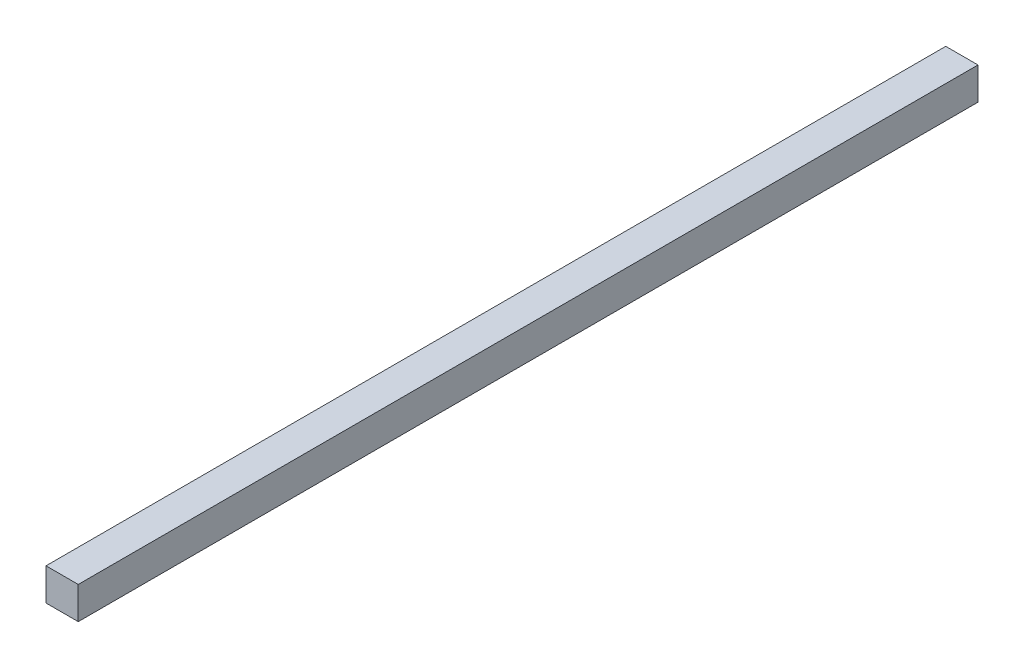
ISO-10303-21;
HEADER;
FILE_DESCRIPTION(('STEP AP214'),'2;1');
FILE_NAME('part.step','',(''),(''),'','','');
FILE_SCHEMA(('AUTOMOTIVE_DESIGN { 1 0 10303 214 1 1 1 1 }'));
ENDSEC;
DATA;
#1=APPLICATION_CONTEXT('core data for automotive mechanical design processes');
#2=APPLICATION_PROTOCOL_DEFINITION('international standard','automotive_design',2000,#1);
#3=PRODUCT_CONTEXT('',#1,'mechanical');
#4=PRODUCT('Part','Part','',(#3));
#5=PRODUCT_RELATED_PRODUCT_CATEGORY('part','',(#4));
#6=PRODUCT_DEFINITION_FORMATION('','',#4);
#7=PRODUCT_DEFINITION_CONTEXT('part definition',#1,'design');
#8=PRODUCT_DEFINITION('design','',#6,#7);
#9=PRODUCT_DEFINITION_SHAPE('','',#8);
#10=(LENGTH_UNIT() NAMED_UNIT(*) SI_UNIT(.MILLI.,.METRE.));
#11=(NAMED_UNIT(*) PLANE_ANGLE_UNIT() SI_UNIT($,.RADIAN.));
#12=(NAMED_UNIT(*) SI_UNIT($,.STERADIAN.) SOLID_ANGLE_UNIT());
#13=UNCERTAINTY_MEASURE_WITH_UNIT(LENGTH_MEASURE(1.E-05),#10,'distance_accuracy_value','');
#14=(GEOMETRIC_REPRESENTATION_CONTEXT(3) GLOBAL_UNCERTAINTY_ASSIGNED_CONTEXT((#13)) GLOBAL_UNIT_ASSIGNED_CONTEXT((#10,
#11,#12)) REPRESENTATION_CONTEXT('',''));
#15=CARTESIAN_POINT('',(0.,0.,0.));
#16=DIRECTION('',(0.,0.,1.));
#17=DIRECTION('',(1.,0.,0.));
#18=AXIS2_PLACEMENT_3D('',#15,#16,#17);
#19=CARTESIAN_POINT('',(1.,1.,55.8));
#20=DIRECTION('',(-1.,0.,0.));
#21=DIRECTION('',(0.,-1.,0.));
#22=AXIS2_PLACEMENT_3D('',#19,#20,#21);
#23=PLANE('',#22);
#24=DIRECTION('',(0.,1.,0.));
#25=VECTOR('',#24,1.);
#26=CARTESIAN_POINT('',(1.,1.,0.));
#27=LINE('',#26,#25);
#28=CARTESIAN_POINT('',(1.,-1.,0.));
#29=VERTEX_POINT('',#28);
#30=CARTESIAN_POINT('',(1.,1.,0.));
#31=VERTEX_POINT('',#30);
#32=EDGE_CURVE('E97',#29,#31,#27,.T.);
#33=ORIENTED_EDGE('',*,*,#32,.T.);
#34=DIRECTION('',(0.,0.,-1.));
#35=VECTOR('',#34,1.);
#36=CARTESIAN_POINT('',(1.,1.,55.8));
#37=LINE('',#36,#35);
#38=CARTESIAN_POINT('',(1.,1.,55.8));
#39=VERTEX_POINT('',#38);
#40=EDGE_CURVE('E11',#39,#31,#37,.T.);
#41=ORIENTED_EDGE('',*,*,#40,.F.);
#42=DIRECTION('',(0.,1.,0.));
#43=VECTOR('',#42,1.);
#44=CARTESIAN_POINT('',(1.,1.,55.8));
#45=LINE('',#44,#43);
#46=CARTESIAN_POINT('',(1.,-1.,55.8));
#47=VERTEX_POINT('',#46);
#48=EDGE_CURVE('E85',#47,#39,#45,.T.);
#49=ORIENTED_EDGE('',*,*,#48,.F.);
#50=DIRECTION('',(0.,0.,-1.));
#51=VECTOR('',#50,1.);
#52=CARTESIAN_POINT('',(1.,-1.,55.8));
#53=LINE('',#52,#51);
#54=EDGE_CURVE('E93',#47,#29,#53,.T.);
#55=ORIENTED_EDGE('',*,*,#54,.T.);
#56=EDGE_LOOP('',(#33,#41,#49,#55));
#57=FACE_BOUND('',#56,.T.);
#58=ADVANCED_FACE('F34',(#57),#23,.F.);
#59=CARTESIAN_POINT('',(-1.,1.,55.8));
#60=DIRECTION('',(0.,-1.,0.));
#61=DIRECTION('',(0.,0.,-1.));
#62=AXIS2_PLACEMENT_3D('',#59,#60,#61);
#63=PLANE('',#62);
#64=DIRECTION('',(-1.,0.,0.));
#65=VECTOR('',#64,1.);
#66=CARTESIAN_POINT('',(-1.,1.,0.));
#67=LINE('',#66,#65);
#68=CARTESIAN_POINT('',(-1.,1.,0.));
#69=VERTEX_POINT('',#68);
#70=EDGE_CURVE('E89',#31,#69,#67,.T.);
#71=ORIENTED_EDGE('',*,*,#70,.T.);
#72=DIRECTION('',(0.,0.,-1.));
#73=VECTOR('',#72,1.);
#74=CARTESIAN_POINT('',(-1.,1.,55.8));
#75=LINE('',#74,#73);
#76=CARTESIAN_POINT('',(-1.,1.,55.8));
#77=VERTEX_POINT('',#76);
#78=EDGE_CURVE('E42',#77,#69,#75,.T.);
#79=ORIENTED_EDGE('',*,*,#78,.F.);
#80=DIRECTION('',(-1.,0.,0.));
#81=VECTOR('',#80,1.);
#82=CARTESIAN_POINT('',(-1.,1.,55.8));
#83=LINE('',#82,#81);
#84=EDGE_CURVE('E80',#39,#77,#83,.T.);
#85=ORIENTED_EDGE('',*,*,#84,.F.);
#86=ORIENTED_EDGE('',*,*,#40,.T.);
#87=EDGE_LOOP('',(#71,#79,#85,#86));
#88=FACE_BOUND('',#87,.T.);
#89=ADVANCED_FACE('F88',(#88),#63,.F.);
#90=CARTESIAN_POINT('',(-1.,1.,55.8));
#91=DIRECTION('',(1.,0.,0.));
#92=DIRECTION('',(0.,1.,0.));
#93=AXIS2_PLACEMENT_3D('',#90,#91,#92);
#94=PLANE('',#93);
#95=DIRECTION('',(0.,-1.,0.));
#96=VECTOR('',#95,1.);
#97=CARTESIAN_POINT('',(-1.,1.,0.));
#98=LINE('',#97,#96);
#99=CARTESIAN_POINT('',(-1.,-1.,0.));
#100=VERTEX_POINT('',#99);
#101=EDGE_CURVE('E67',#69,#100,#98,.T.);
#102=ORIENTED_EDGE('',*,*,#101,.T.);
#103=DIRECTION('',(0.,0.,-1.));
#104=VECTOR('',#103,1.);
#105=CARTESIAN_POINT('',(-1.,-1.,55.8));
#106=LINE('',#105,#104);
#107=CARTESIAN_POINT('',(-1.,-1.,55.8));
#108=VERTEX_POINT('',#107);
#109=EDGE_CURVE('E90',#108,#100,#106,.T.);
#110=ORIENTED_EDGE('',*,*,#109,.F.);
#111=DIRECTION('',(0.,-1.,0.));
#112=VECTOR('',#111,1.);
#113=CARTESIAN_POINT('',(-1.,1.,55.8));
#114=LINE('',#113,#112);
#115=EDGE_CURVE('E83',#77,#108,#114,.T.);
#116=ORIENTED_EDGE('',*,*,#115,.F.);
#117=ORIENTED_EDGE('',*,*,#78,.T.);
#118=EDGE_LOOP('',(#102,#110,#116,#117));
#119=FACE_BOUND('',#118,.T.);
#120=ADVANCED_FACE('F91',(#119),#94,.F.);
#121=CARTESIAN_POINT('',(-1.,-1.,55.8));
#122=DIRECTION('',(0.,1.,0.));
#123=DIRECTION('',(0.,0.,1.));
#124=AXIS2_PLACEMENT_3D('',#121,#122,#123);
#125=PLANE('',#124);
#126=DIRECTION('',(1.,0.,0.));
#127=VECTOR('',#126,1.);
#128=CARTESIAN_POINT('',(-1.,-1.,0.));
#129=LINE('',#128,#127);
#130=EDGE_CURVE('E73',#100,#29,#129,.T.);
#131=ORIENTED_EDGE('',*,*,#130,.T.);
#132=ORIENTED_EDGE('',*,*,#54,.F.);
#133=DIRECTION('',(1.,0.,0.));
#134=VECTOR('',#133,1.);
#135=CARTESIAN_POINT('',(-1.,-1.,55.8));
#136=LINE('',#135,#134);
#137=EDGE_CURVE('E50',#108,#47,#136,.T.);
#138=ORIENTED_EDGE('',*,*,#137,.F.);
#139=ORIENTED_EDGE('',*,*,#109,.T.);
#140=EDGE_LOOP('',(#131,#132,#138,#139));
#141=FACE_BOUND('',#140,.T.);
#142=ADVANCED_FACE('F104',(#141),#125,.F.);
#143=CARTESIAN_POINT('',(0.,0.,55.8));
#144=DIRECTION('',(0.,0.,1.));
#145=DIRECTION('',(1.,0.,0.));
#146=AXIS2_PLACEMENT_3D('',#143,#144,#145);
#147=PLANE('',#146);
#148=ORIENTED_EDGE('',*,*,#48,.T.);
#149=ORIENTED_EDGE('',*,*,#84,.T.);
#150=ORIENTED_EDGE('',*,*,#115,.T.);
#151=ORIENTED_EDGE('',*,*,#137,.T.);
#152=EDGE_LOOP('',(#148,#149,#150,#151));
#153=FACE_BOUND('',#152,.T.);
#154=ADVANCED_FACE('F81',(#153),#147,.T.);
#155=CARTESIAN_POINT('',(0.,0.,0.));
#156=DIRECTION('',(0.,0.,1.));
#157=DIRECTION('',(1.,0.,0.));
#158=AXIS2_PLACEMENT_3D('',#155,#156,#157);
#159=PLANE('',#158);
#160=ORIENTED_EDGE('',*,*,#32,.F.);
#161=ORIENTED_EDGE('',*,*,#130,.F.);
#162=ORIENTED_EDGE('',*,*,#101,.F.);
#163=ORIENTED_EDGE('',*,*,#70,.F.);
#164=EDGE_LOOP('',(#160,#161,#162,#163));
#165=FACE_BOUND('',#164,.T.);
#166=ADVANCED_FACE('F107',(#165),#159,.F.);
#167=CLOSED_SHELL('',(#58,#89,#120,#142,#154,#166));
#168=MANIFOLD_SOLID_BREP('B2',#167);
#169=ADVANCED_BREP_SHAPE_REPRESENTATION('',(#18,#168),#14);
#170=SHAPE_DEFINITION_REPRESENTATION(#9,#169);
ENDSEC;
END-ISO-10303-21;
